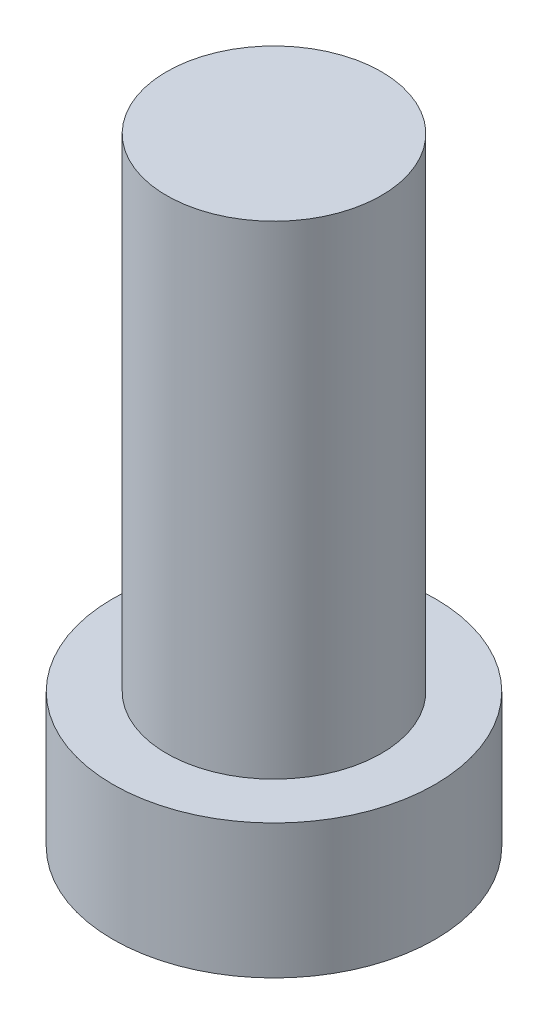
ISO-10303-21;
HEADER;
FILE_DESCRIPTION(('STEP AP214'),'2;1');
FILE_NAME('part.step','',(''),(''),'','','');
FILE_SCHEMA(('AUTOMOTIVE_DESIGN { 1 0 10303 214 1 1 1 1 }'));
ENDSEC;
DATA;
#1=APPLICATION_CONTEXT('core data for automotive mechanical design processes');
#2=APPLICATION_PROTOCOL_DEFINITION('international standard','automotive_design',2000,#1);
#3=PRODUCT_CONTEXT('',#1,'mechanical');
#4=PRODUCT('Part','Part','',(#3));
#5=PRODUCT_RELATED_PRODUCT_CATEGORY('part','',(#4));
#6=PRODUCT_DEFINITION_FORMATION('','',#4);
#7=PRODUCT_DEFINITION_CONTEXT('part definition',#1,'design');
#8=PRODUCT_DEFINITION('design','',#6,#7);
#9=PRODUCT_DEFINITION_SHAPE('','',#8);
#10=(LENGTH_UNIT() NAMED_UNIT(*) SI_UNIT(.MILLI.,.METRE.));
#11=(NAMED_UNIT(*) PLANE_ANGLE_UNIT() SI_UNIT($,.RADIAN.));
#12=(NAMED_UNIT(*) SI_UNIT($,.STERADIAN.) SOLID_ANGLE_UNIT());
#13=UNCERTAINTY_MEASURE_WITH_UNIT(LENGTH_MEASURE(1.E-05),#10,'distance_accuracy_value','');
#14=(GEOMETRIC_REPRESENTATION_CONTEXT(3) GLOBAL_UNCERTAINTY_ASSIGNED_CONTEXT((#13)) GLOBAL_UNIT_ASSIGNED_CONTEXT((#10,
#11,#12)) REPRESENTATION_CONTEXT('',''));
#15=CARTESIAN_POINT('',(0.,0.,0.));
#16=DIRECTION('',(0.,0.,1.));
#17=DIRECTION('',(1.,0.,0.));
#18=AXIS2_PLACEMENT_3D('',#15,#16,#17);
#19=CARTESIAN_POINT('',(0.,25.,0.));
#20=DIRECTION('',(0.,-1.,0.));
#21=DIRECTION('',(0.,0.,-1.));
#22=AXIS2_PLACEMENT_3D('',#19,#20,#21);
#23=CYLINDRICAL_SURFACE('',#22,30.);
#24=CARTESIAN_POINT('',(0.,25.,0.));
#25=DIRECTION('',(0.,1.,0.));
#26=DIRECTION('',(0.,0.,1.));
#27=AXIS2_PLACEMENT_3D('',#24,#25,#26);
#28=CIRCLE('',#27,30.);
#29=CARTESIAN_POINT('',(0.,25.,30.));
#30=VERTEX_POINT('',#29);
#31=EDGE_CURVE('E41',#30,#30,#28,.T.);
#32=ORIENTED_EDGE('',*,*,#31,.F.);
#33=EDGE_LOOP('',(#32));
#34=FACE_BOUND('',#33,.T.);
#35=CARTESIAN_POINT('',(0.,0.,0.));
#36=DIRECTION('',(0.,1.,0.));
#37=DIRECTION('',(0.,0.,1.));
#38=AXIS2_PLACEMENT_3D('',#35,#36,#37);
#39=CIRCLE('',#38,30.);
#40=CARTESIAN_POINT('',(0.,0.,30.));
#41=VERTEX_POINT('',#40);
#42=EDGE_CURVE('E37',#41,#41,#39,.T.);
#43=ORIENTED_EDGE('',*,*,#42,.T.);
#44=EDGE_LOOP('',(#43));
#45=FACE_BOUND('',#44,.T.);
#46=ADVANCED_FACE('F34',(#34,#45),#23,.T.);
#47=CARTESIAN_POINT('',(0.,25.,0.));
#48=DIRECTION('',(0.,1.,0.));
#49=DIRECTION('',(0.,0.,1.));
#50=AXIS2_PLACEMENT_3D('',#47,#48,#49);
#51=PLANE('',#50);
#52=CARTESIAN_POINT('',(0.,25.,0.));
#53=DIRECTION('',(0.,1.,0.));
#54=DIRECTION('',(0.,0.,1.));
#55=AXIS2_PLACEMENT_3D('',#52,#53,#54);
#56=CIRCLE('',#55,20.);
#57=CARTESIAN_POINT('',(0.,25.,-20.));
#58=VERTEX_POINT('',#57);
#59=EDGE_CURVE('E10',#58,#58,#56,.T.);
#60=ORIENTED_EDGE('',*,*,#59,.F.);
#61=EDGE_LOOP('',(#60));
#62=FACE_BOUND('',#61,.T.);
#63=ORIENTED_EDGE('',*,*,#31,.T.);
#64=EDGE_LOOP('',(#63));
#65=FACE_BOUND('',#64,.T.);
#66=ADVANCED_FACE('F58',(#62,#65),#51,.T.);
#67=CARTESIAN_POINT('',(0.,0.,0.));
#68=DIRECTION('',(0.,1.,0.));
#69=DIRECTION('',(0.,0.,1.));
#70=AXIS2_PLACEMENT_3D('',#67,#68,#69);
#71=PLANE('',#70);
#72=ORIENTED_EDGE('',*,*,#42,.F.);
#73=EDGE_LOOP('',(#72));
#74=FACE_BOUND('',#73,.T.);
#75=ADVANCED_FACE('F55',(#74),#71,.F.);
#76=CARTESIAN_POINT('',(0.,115.,0.));
#77=DIRECTION('',(0.,-1.,0.));
#78=DIRECTION('',(0.,0.,-1.));
#79=AXIS2_PLACEMENT_3D('',#76,#77,#78);
#80=CYLINDRICAL_SURFACE('',#79,20.);
#81=CARTESIAN_POINT('',(0.,115.,0.));
#82=DIRECTION('',(0.,1.,0.));
#83=DIRECTION('',(0.,0.,1.));
#84=AXIS2_PLACEMENT_3D('',#81,#82,#83);
#85=CIRCLE('',#84,20.);
#86=CARTESIAN_POINT('',(0.,115.,-20.));
#87=VERTEX_POINT('',#86);
#88=EDGE_CURVE('E47',#87,#87,#85,.T.);
#89=CARTESIAN_POINT('',(0.,115.,-20.));
#90=CARTESIAN_POINT('',(0.,114.0625,-20.));
#91=CARTESIAN_POINT('',(0.,113.125,-20.));
#92=CARTESIAN_POINT('',(0.,111.25,-20.));
#93=CARTESIAN_POINT('',(0.,110.3125,-20.));
#94=CARTESIAN_POINT('',(0.,108.4375,-20.));
#95=CARTESIAN_POINT('',(0.,107.5,-20.));
#96=CARTESIAN_POINT('',(0.,105.625,-20.));
#97=CARTESIAN_POINT('',(0.,104.6875,-20.));
#98=CARTESIAN_POINT('',(0.,102.8125,-20.));
#99=CARTESIAN_POINT('',(0.,101.875,-20.));
#100=CARTESIAN_POINT('',(0.,100.,-20.));
#101=CARTESIAN_POINT('',(0.,99.0625,-20.));
#102=CARTESIAN_POINT('',(0.,97.1875,-20.));
#103=CARTESIAN_POINT('',(0.,96.25,-20.));
#104=CARTESIAN_POINT('',(0.,94.375,-20.));
#105=CARTESIAN_POINT('',(0.,93.4375,-20.));
#106=CARTESIAN_POINT('',(0.,91.5625,-20.));
#107=CARTESIAN_POINT('',(0.,90.625,-20.));
#108=CARTESIAN_POINT('',(0.,88.75,-20.));
#109=CARTESIAN_POINT('',(0.,87.8125,-20.));
#110=CARTESIAN_POINT('',(0.,85.9375,-20.));
#111=CARTESIAN_POINT('',(0.,85.,-20.));
#112=CARTESIAN_POINT('',(0.,83.125,-20.));
#113=CARTESIAN_POINT('',(0.,82.1875,-20.));
#114=CARTESIAN_POINT('',(0.,80.3125,-20.));
#115=CARTESIAN_POINT('',(0.,79.375,-20.));
#116=CARTESIAN_POINT('',(0.,77.5,-20.));
#117=CARTESIAN_POINT('',(0.,76.5625,-20.));
#118=CARTESIAN_POINT('',(0.,74.6875,-20.));
#119=CARTESIAN_POINT('',(0.,73.75,-20.));
#120=CARTESIAN_POINT('',(0.,71.875,-20.));
#121=CARTESIAN_POINT('',(0.,70.9375,-20.));
#122=CARTESIAN_POINT('',(0.,69.0625,-20.));
#123=CARTESIAN_POINT('',(0.,68.125,-20.));
#124=CARTESIAN_POINT('',(0.,66.25,-20.));
#125=CARTESIAN_POINT('',(0.,65.3125,-20.));
#126=CARTESIAN_POINT('',(0.,63.4375,-20.));
#127=CARTESIAN_POINT('',(0.,62.5,-20.));
#128=CARTESIAN_POINT('',(0.,60.625,-20.));
#129=CARTESIAN_POINT('',(0.,59.6875,-20.));
#130=CARTESIAN_POINT('',(0.,57.8125,-20.));
#131=CARTESIAN_POINT('',(0.,56.875,-20.));
#132=CARTESIAN_POINT('',(0.,55.,-20.));
#133=CARTESIAN_POINT('',(0.,54.0625,-20.));
#134=CARTESIAN_POINT('',(0.,52.1875,-20.));
#135=CARTESIAN_POINT('',(0.,51.25,-20.));
#136=CARTESIAN_POINT('',(0.,49.375,-20.));
#137=CARTESIAN_POINT('',(0.,48.4375,-20.));
#138=CARTESIAN_POINT('',(0.,46.5625,-20.));
#139=CARTESIAN_POINT('',(0.,45.625,-20.));
#140=CARTESIAN_POINT('',(0.,43.75,-20.));
#141=CARTESIAN_POINT('',(0.,42.8125,-20.));
#142=CARTESIAN_POINT('',(0.,40.9375,-20.));
#143=CARTESIAN_POINT('',(0.,40.,-20.));
#144=CARTESIAN_POINT('',(0.,38.125,-20.));
#145=CARTESIAN_POINT('',(0.,37.1875,-20.));
#146=CARTESIAN_POINT('',(0.,35.3125,-20.));
#147=CARTESIAN_POINT('',(0.,34.375,-20.));
#148=CARTESIAN_POINT('',(0.,32.5,-20.));
#149=CARTESIAN_POINT('',(0.,31.5625,-20.));
#150=CARTESIAN_POINT('',(0.,29.6875,-20.));
#151=CARTESIAN_POINT('',(0.,28.75,-20.));
#152=CARTESIAN_POINT('',(0.,26.875,-20.));
#153=CARTESIAN_POINT('',(0.,25.9375,-20.));
#154=CARTESIAN_POINT('',(0.,25.,-20.));
#155=B_SPLINE_CURVE_WITH_KNOTS('',3,(#89,#90,#91,#92,#93,#94,#95,#96,#97,#98,#99,#100,#101,#102,
#103,#104,#105,#106,#107,#108,#109,#110,#111,#112,#113,#114,#115,#116,#117,#118,#119,#120,#121,
#122,#123,#124,#125,#126,#127,#128,#129,#130,#131,#132,#133,#134,#135,#136,#137,#138,#139,#140,
#141,#142,#143,#144,#145,#146,#147,#148,#149,#150,#151,#152,#153,#154),.UNSPECIFIED.,.F.,.F.,(4,
2,2,2,2,2,2,2,2,2,2,2,2,2,2,2,2,2,2,2,2,2,2,2,2,2,2,2,2,2,2,2,4),(0.,2.81250000000001,
5.62500000000001,8.4375,11.25,14.0625,16.875,19.6875,22.5,25.3125,28.125,30.9375,33.75,36.5625,
39.375,42.1875,45.,47.8125,50.625,53.4375,56.25,59.0625,61.875,64.6875,67.5,70.3125,73.125,
75.9375,78.75,81.5625,84.375,87.1875,90.),.UNSPECIFIED.);
#156=EDGE_CURVE('BSEAM57',#87,#58,#155,.T.);
#157=ORIENTED_EDGE('',*,*,#88,.F.);
#158=ORIENTED_EDGE('',*,*,#59,.T.);
#159=ORIENTED_EDGE('',*,*,#156,.T.);
#160=ORIENTED_EDGE('',*,*,#156,.F.);
#161=EDGE_LOOP('',(#157,#159,#158,#160));
#162=FACE_BOUND('',#161,.T.);
#163=ADVANCED_FACE('F57',(#162),#80,.T.);
#164=CARTESIAN_POINT('',(0.,115.,0.));
#165=DIRECTION('',(0.,1.,0.));
#166=DIRECTION('',(0.,0.,1.));
#167=AXIS2_PLACEMENT_3D('',#164,#165,#166);
#168=PLANE('',#167);
#169=ORIENTED_EDGE('',*,*,#88,.T.);
#170=EDGE_LOOP('',(#169));
#171=FACE_BOUND('',#170,.T.);
#172=ADVANCED_FACE('F63',(#171),#168,.T.);
#173=CLOSED_SHELL('',(#46,#66,#75,#163,#172));
#174=MANIFOLD_SOLID_BREP('B2',#173);
#175=ADVANCED_BREP_SHAPE_REPRESENTATION('',(#18,#174),#14);
#176=SHAPE_DEFINITION_REPRESENTATION(#9,#175);
ENDSEC;
END-ISO-10303-21;
